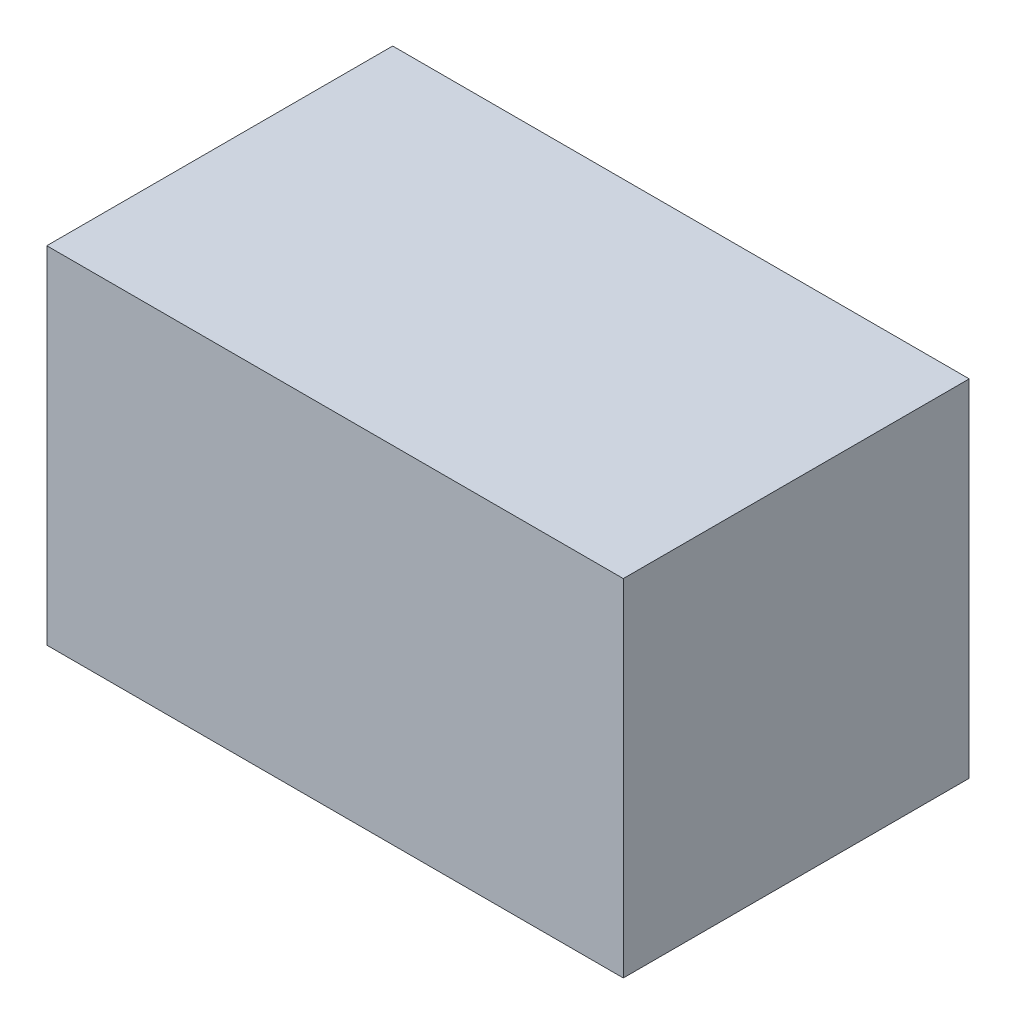
ISO-10303-21;
HEADER;
FILE_DESCRIPTION(('STEP AP214'),'2;1');
FILE_NAME('part.step','',(''),(''),'','','');
FILE_SCHEMA(('AUTOMOTIVE_DESIGN { 1 0 10303 214 1 1 1 1 }'));
ENDSEC;
DATA;
#1=APPLICATION_CONTEXT('core data for automotive mechanical design processes');
#2=APPLICATION_PROTOCOL_DEFINITION('international standard','automotive_design',2000,#1);
#3=PRODUCT_CONTEXT('',#1,'mechanical');
#4=PRODUCT('Part','Part','',(#3));
#5=PRODUCT_RELATED_PRODUCT_CATEGORY('part','',(#4));
#6=PRODUCT_DEFINITION_FORMATION('','',#4);
#7=PRODUCT_DEFINITION_CONTEXT('part definition',#1,'design');
#8=PRODUCT_DEFINITION('design','',#6,#7);
#9=PRODUCT_DEFINITION_SHAPE('','',#8);
#10=(LENGTH_UNIT() NAMED_UNIT(*) SI_UNIT(.MILLI.,.METRE.));
#11=(NAMED_UNIT(*) PLANE_ANGLE_UNIT() SI_UNIT($,.RADIAN.));
#12=(NAMED_UNIT(*) SI_UNIT($,.STERADIAN.) SOLID_ANGLE_UNIT());
#13=UNCERTAINTY_MEASURE_WITH_UNIT(LENGTH_MEASURE(1.E-05),#10,'distance_accuracy_value','');
#14=(GEOMETRIC_REPRESENTATION_CONTEXT(3) GLOBAL_UNCERTAINTY_ASSIGNED_CONTEXT((#13)) GLOBAL_UNIT_ASSIGNED_CONTEXT((#10,
#11,#12)) REPRESENTATION_CONTEXT('',''));
#15=CARTESIAN_POINT('',(0.,0.,0.));
#16=DIRECTION('',(0.,0.,1.));
#17=DIRECTION('',(1.,0.,0.));
#18=AXIS2_PLACEMENT_3D('',#15,#16,#17);
#19=CARTESIAN_POINT('',(25.,15.,30.));
#20=DIRECTION('',(-1.,0.,0.));
#21=DIRECTION('',(0.,-1.,0.));
#22=AXIS2_PLACEMENT_3D('',#19,#20,#21);
#23=PLANE('',#22);
#24=DIRECTION('',(0.,1.,0.));
#25=VECTOR('',#24,1.);
#26=CARTESIAN_POINT('',(25.,15.,0.));
#27=LINE('',#26,#25);
#28=CARTESIAN_POINT('',(25.,-15.,0.));
#29=VERTEX_POINT('',#28);
#30=CARTESIAN_POINT('',(25.,15.,0.));
#31=VERTEX_POINT('',#30);
#32=EDGE_CURVE('E98',#29,#31,#27,.T.);
#33=ORIENTED_EDGE('',*,*,#32,.T.);
#34=DIRECTION('',(0.,0.,-1.));
#35=VECTOR('',#34,1.);
#36=CARTESIAN_POINT('',(25.,15.,30.));
#37=LINE('',#36,#35);
#38=CARTESIAN_POINT('',(25.,15.,30.));
#39=VERTEX_POINT('',#38);
#40=EDGE_CURVE('E11',#39,#31,#37,.T.);
#41=ORIENTED_EDGE('',*,*,#40,.F.);
#42=DIRECTION('',(0.,1.,0.));
#43=VECTOR('',#42,1.);
#44=CARTESIAN_POINT('',(25.,15.,30.));
#45=LINE('',#44,#43);
#46=CARTESIAN_POINT('',(25.,-15.,30.));
#47=VERTEX_POINT('',#46);
#48=EDGE_CURVE('E86',#47,#39,#45,.T.);
#49=ORIENTED_EDGE('',*,*,#48,.F.);
#50=DIRECTION('',(0.,0.,-1.));
#51=VECTOR('',#50,1.);
#52=CARTESIAN_POINT('',(25.,-15.,30.));
#53=LINE('',#52,#51);
#54=EDGE_CURVE('E94',#47,#29,#53,.T.);
#55=ORIENTED_EDGE('',*,*,#54,.T.);
#56=EDGE_LOOP('',(#33,#41,#49,#55));
#57=FACE_BOUND('',#56,.T.);
#58=ADVANCED_FACE('F35',(#57),#23,.F.);
#59=CARTESIAN_POINT('',(-25.,15.,30.));
#60=DIRECTION('',(0.,-1.,0.));
#61=DIRECTION('',(0.,0.,-1.));
#62=AXIS2_PLACEMENT_3D('',#59,#60,#61);
#63=PLANE('',#62);
#64=DIRECTION('',(-1.,0.,0.));
#65=VECTOR('',#64,1.);
#66=CARTESIAN_POINT('',(-25.,15.,0.));
#67=LINE('',#66,#65);
#68=CARTESIAN_POINT('',(-25.,15.,0.));
#69=VERTEX_POINT('',#68);
#70=EDGE_CURVE('E90',#31,#69,#67,.T.);
#71=ORIENTED_EDGE('',*,*,#70,.T.);
#72=DIRECTION('',(0.,0.,-1.));
#73=VECTOR('',#72,1.);
#74=CARTESIAN_POINT('',(-25.,15.,30.));
#75=LINE('',#74,#73);
#76=CARTESIAN_POINT('',(-25.,15.,30.));
#77=VERTEX_POINT('',#76);
#78=EDGE_CURVE('E43',#77,#69,#75,.T.);
#79=ORIENTED_EDGE('',*,*,#78,.F.);
#80=DIRECTION('',(-1.,0.,0.));
#81=VECTOR('',#80,1.);
#82=CARTESIAN_POINT('',(-25.,15.,30.));
#83=LINE('',#82,#81);
#84=EDGE_CURVE('E81',#39,#77,#83,.T.);
#85=ORIENTED_EDGE('',*,*,#84,.F.);
#86=ORIENTED_EDGE('',*,*,#40,.T.);
#87=EDGE_LOOP('',(#71,#79,#85,#86));
#88=FACE_BOUND('',#87,.T.);
#89=ADVANCED_FACE('F89',(#88),#63,.F.);
#90=CARTESIAN_POINT('',(-25.,15.,30.));
#91=DIRECTION('',(1.,0.,0.));
#92=DIRECTION('',(0.,1.,0.));
#93=AXIS2_PLACEMENT_3D('',#90,#91,#92);
#94=PLANE('',#93);
#95=DIRECTION('',(0.,-1.,0.));
#96=VECTOR('',#95,1.);
#97=CARTESIAN_POINT('',(-25.,15.,0.));
#98=LINE('',#97,#96);
#99=CARTESIAN_POINT('',(-25.,-15.,0.));
#100=VERTEX_POINT('',#99);
#101=EDGE_CURVE('E68',#69,#100,#98,.T.);
#102=ORIENTED_EDGE('',*,*,#101,.T.);
#103=DIRECTION('',(0.,0.,-1.));
#104=VECTOR('',#103,1.);
#105=CARTESIAN_POINT('',(-25.,-15.,30.));
#106=LINE('',#105,#104);
#107=CARTESIAN_POINT('',(-25.,-15.,30.));
#108=VERTEX_POINT('',#107);
#109=EDGE_CURVE('E91',#108,#100,#106,.T.);
#110=ORIENTED_EDGE('',*,*,#109,.F.);
#111=DIRECTION('',(0.,-1.,0.));
#112=VECTOR('',#111,1.);
#113=CARTESIAN_POINT('',(-25.,15.,30.));
#114=LINE('',#113,#112);
#115=EDGE_CURVE('E84',#77,#108,#114,.T.);
#116=ORIENTED_EDGE('',*,*,#115,.F.);
#117=ORIENTED_EDGE('',*,*,#78,.T.);
#118=EDGE_LOOP('',(#102,#110,#116,#117));
#119=FACE_BOUND('',#118,.T.);
#120=ADVANCED_FACE('F92',(#119),#94,.F.);
#121=CARTESIAN_POINT('',(-25.,-15.,30.));
#122=DIRECTION('',(0.,1.,0.));
#123=DIRECTION('',(0.,0.,1.));
#124=AXIS2_PLACEMENT_3D('',#121,#122,#123);
#125=PLANE('',#124);
#126=DIRECTION('',(1.,0.,0.));
#127=VECTOR('',#126,1.);
#128=CARTESIAN_POINT('',(-25.,-15.,0.));
#129=LINE('',#128,#127);
#130=EDGE_CURVE('E74',#100,#29,#129,.T.);
#131=ORIENTED_EDGE('',*,*,#130,.T.);
#132=ORIENTED_EDGE('',*,*,#54,.F.);
#133=DIRECTION('',(1.,0.,0.));
#134=VECTOR('',#133,1.);
#135=CARTESIAN_POINT('',(-25.,-15.,30.));
#136=LINE('',#135,#134);
#137=EDGE_CURVE('E51',#108,#47,#136,.T.);
#138=ORIENTED_EDGE('',*,*,#137,.F.);
#139=ORIENTED_EDGE('',*,*,#109,.T.);
#140=EDGE_LOOP('',(#131,#132,#138,#139));
#141=FACE_BOUND('',#140,.T.);
#142=ADVANCED_FACE('F105',(#141),#125,.F.);
#143=CARTESIAN_POINT('',(0.,0.,30.));
#144=DIRECTION('',(0.,0.,1.));
#145=DIRECTION('',(1.,0.,0.));
#146=AXIS2_PLACEMENT_3D('',#143,#144,#145);
#147=PLANE('',#146);
#148=ORIENTED_EDGE('',*,*,#48,.T.);
#149=ORIENTED_EDGE('',*,*,#84,.T.);
#150=ORIENTED_EDGE('',*,*,#115,.T.);
#151=ORIENTED_EDGE('',*,*,#137,.T.);
#152=EDGE_LOOP('',(#148,#149,#150,#151));
#153=FACE_BOUND('',#152,.T.);
#154=ADVANCED_FACE('F82',(#153),#147,.T.);
#155=CARTESIAN_POINT('',(0.,0.,0.));
#156=DIRECTION('',(0.,0.,1.));
#157=DIRECTION('',(1.,0.,0.));
#158=AXIS2_PLACEMENT_3D('',#155,#156,#157);
#159=PLANE('',#158);
#160=ORIENTED_EDGE('',*,*,#32,.F.);
#161=ORIENTED_EDGE('',*,*,#130,.F.);
#162=ORIENTED_EDGE('',*,*,#101,.F.);
#163=ORIENTED_EDGE('',*,*,#70,.F.);
#164=EDGE_LOOP('',(#160,#161,#162,#163));
#165=FACE_BOUND('',#164,.T.);
#166=ADVANCED_FACE('F108',(#165),#159,.F.);
#167=CLOSED_SHELL('',(#58,#89,#120,#142,#154,#166));
#168=MANIFOLD_SOLID_BREP('B2',#167);
#169=ADVANCED_BREP_SHAPE_REPRESENTATION('',(#18,#168),#14);
#170=SHAPE_DEFINITION_REPRESENTATION(#9,#169);
ENDSEC;
END-ISO-10303-21;
